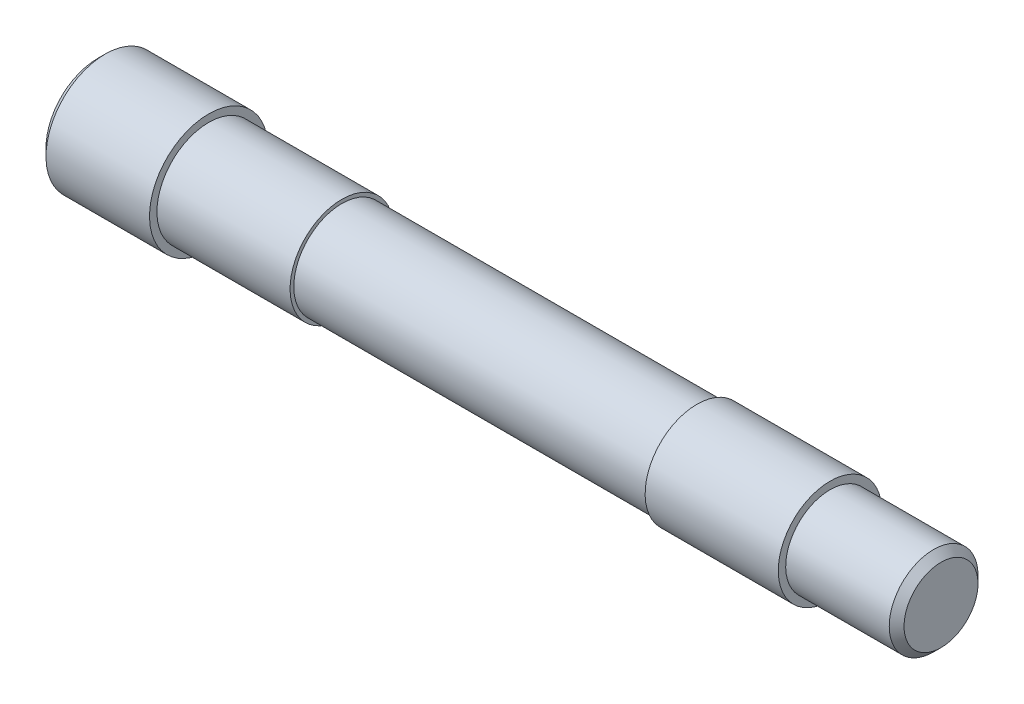
ISO-10303-21;
HEADER;
FILE_DESCRIPTION(('STEP AP214'),'2;1');
FILE_NAME('part.step','',(''),(''),'','','');
FILE_SCHEMA(('AUTOMOTIVE_DESIGN { 1 0 10303 214 1 1 1 1 }'));
ENDSEC;
DATA;
#1=APPLICATION_CONTEXT('core data for automotive mechanical design processes');
#2=APPLICATION_PROTOCOL_DEFINITION('international standard','automotive_design',2000,#1);
#3=PRODUCT_CONTEXT('',#1,'mechanical');
#4=PRODUCT('Part','Part','',(#3));
#5=PRODUCT_RELATED_PRODUCT_CATEGORY('part','',(#4));
#6=PRODUCT_DEFINITION_FORMATION('','',#4);
#7=PRODUCT_DEFINITION_CONTEXT('part definition',#1,'design');
#8=PRODUCT_DEFINITION('design','',#6,#7);
#9=PRODUCT_DEFINITION_SHAPE('','',#8);
#10=(LENGTH_UNIT() NAMED_UNIT(*) SI_UNIT(.MILLI.,.METRE.));
#11=(NAMED_UNIT(*) PLANE_ANGLE_UNIT() SI_UNIT($,.RADIAN.));
#12=(NAMED_UNIT(*) SI_UNIT($,.STERADIAN.) SOLID_ANGLE_UNIT());
#13=UNCERTAINTY_MEASURE_WITH_UNIT(LENGTH_MEASURE(1.E-05),#10,'distance_accuracy_value','');
#14=(GEOMETRIC_REPRESENTATION_CONTEXT(3) GLOBAL_UNCERTAINTY_ASSIGNED_CONTEXT((#13)) GLOBAL_UNIT_ASSIGNED_CONTEXT((#10,
#11,#12)) REPRESENTATION_CONTEXT('',''));
#15=CARTESIAN_POINT('',(0.,0.,0.));
#16=DIRECTION('',(0.,0.,1.));
#17=DIRECTION('',(1.,0.,0.));
#18=AXIS2_PLACEMENT_3D('',#15,#16,#17);
#19=CARTESIAN_POINT('',(90.4875,0.,0.));
#20=DIRECTION('',(1.,0.,0.));
#21=DIRECTION('',(0.,1.,0.));
#22=AXIS2_PLACEMENT_3D('',#19,#20,#21);
#23=CYLINDRICAL_SURFACE('',#22,11.1125);
#24=CARTESIAN_POINT('',(-66.675,0.,0.));
#25=DIRECTION('',(1.,0.,0.));
#26=DIRECTION('',(0.,1.,0.));
#27=AXIS2_PLACEMENT_3D('',#24,#25,#26);
#28=CIRCLE('',#27,11.1125);
#29=CARTESIAN_POINT('',(-66.675,11.1125,0.));
#30=VERTEX_POINT('',#29);
#31=EDGE_CURVE('E99',#30,#30,#28,.T.);
#32=ORIENTED_EDGE('',*,*,#31,.T.);
#33=EDGE_LOOP('',(#32));
#34=FACE_BOUND('',#33,.T.);
#35=CARTESIAN_POINT('',(-38.1,0.,0.));
#36=DIRECTION('',(1.,0.,0.));
#37=DIRECTION('',(0.,1.,0.));
#38=AXIS2_PLACEMENT_3D('',#35,#36,#37);
#39=CIRCLE('',#38,11.1125);
#40=CARTESIAN_POINT('',(-38.1,11.1125,0.));
#41=VERTEX_POINT('',#40);
#42=EDGE_CURVE('E95',#41,#41,#39,.T.);
#43=ORIENTED_EDGE('',*,*,#42,.F.);
#44=EDGE_LOOP('',(#43));
#45=FACE_BOUND('',#44,.T.);
#46=CARTESIAN_POINT('',(-52.3875,-10.0402315710346,-4.76250000000007));
#47=CARTESIAN_POINT('',(-52.5141828804468,-10.0402325969404,-4.76249904362129));
#48=CARTESIAN_POINT('',(-52.6409064333006,-10.0426375136056,-4.75743803928859));
#49=CARTESIAN_POINT('',(-52.8934250466017,-10.052177346996,-4.73724682752057));
#50=CARTESIAN_POINT('',(-53.0192194731577,-10.0593152367777,-4.72211029103261));
#51=CARTESIAN_POINT('',(-53.2691379894666,-10.0780939995445,-4.68189812277268));
#52=CARTESIAN_POINT('',(-53.3932580929368,-10.0897441420218,-4.65680202851194));
#53=CARTESIAN_POINT('',(-53.6387244643791,-10.1171598826129,-4.59693531067393));
#54=CARTESIAN_POINT('',(-53.7600695374984,-10.1329272184985,-4.56216060156893));
#55=CARTESIAN_POINT('',(-53.9985897140359,-10.1679895638285,-4.48346833541121));
#56=CARTESIAN_POINT('',(-54.1157817240076,-10.1872676592125,-4.43959448106279));
#57=CARTESIAN_POINT('',(-54.3459229544943,-10.2288238220674,-4.342992474337));
#58=CARTESIAN_POINT('',(-54.4588705552433,-10.2511030202539,-4.29026098283804));
#59=CARTESIAN_POINT('',(-54.7902658898937,-10.3214847106019,-4.11943845683515));
#60=CARTESIAN_POINT('',(-55.0015564491775,-10.3731764446023,-3.98862276285137));
#61=CARTESIAN_POINT('',(-55.4124344926916,-10.4840302210821,-3.68781125380695));
#62=CARTESIAN_POINT('',(-55.6105664688738,-10.5434541391098,-3.51594021831403));
#63=CARTESIAN_POINT('',(-55.9763771864909,-10.6609693699898,-3.14161553012609));
#64=CARTESIAN_POINT('',(-56.1440437828889,-10.7190601433559,-2.9391497394736));
#65=CARTESIAN_POINT('',(-56.3728288056631,-10.8020251157082,-2.61103699792038));
#66=CARTESIAN_POINT('',(-56.44666382215,-10.829543805133,-2.49472243464819));
#67=CARTESIAN_POINT('',(-56.5841992555438,-10.8818420364386,-2.25568279699365));
#68=CARTESIAN_POINT('',(-56.6479039018757,-10.9066227201098,-2.13296042644513));
#69=CARTESIAN_POINT('',(-56.7646056405788,-10.9527361704598,-1.88189373147878));
#70=CARTESIAN_POINT('',(-56.817601862065,-10.9740686566785,-1.75354895083864));
#71=CARTESIAN_POINT('',(-56.9123154621578,-11.0126442464736,-1.49222995833974));
#72=CARTESIAN_POINT('',(-56.9540385586117,-11.0298894226294,-1.35925813214682));
#73=CARTESIAN_POINT('',(-57.0238127155756,-11.0589645161395,-1.0970013136905));
#74=CARTESIAN_POINT('',(-57.0524828153416,-11.0710375060906,-0.967907801908478));
#75=CARTESIAN_POINT('',(-57.0990098975254,-11.090722703686,-0.707505404253108));
#76=CARTESIAN_POINT('',(-57.1168717558027,-11.0983369227396,-0.576197544846698));
#77=CARTESIAN_POINT('',(-57.1415901213372,-11.1088927374394,-0.312383248294223));
#78=CARTESIAN_POINT('',(-57.1484483538287,-11.1118350655803,-0.179877002317412));
#79=CARTESIAN_POINT('',(-57.1510817258316,-11.1129635440452,0.0852632517530881));
#80=CARTESIAN_POINT('',(-57.1468573249695,-11.1111498916125,0.21789725432032));
#81=CARTESIAN_POINT('',(-57.1280084792185,-11.1030899023065,0.473657223833151));
#82=CARTESIAN_POINT('',(-57.1140733986282,-11.0971374396123,0.59684398197315));
#83=CARTESIAN_POINT('',(-57.0766930569777,-11.081267776878,0.841546457427787));
#84=CARTESIAN_POINT('',(-57.0532446608771,-11.0713492698738,0.963061610216201));
#85=CARTESIAN_POINT('',(-56.9970743252758,-11.0477949789557,1.20352157803154));
#86=CARTESIAN_POINT('',(-56.9643554674778,-11.034160430392,1.32246723309756));
#87=CARTESIAN_POINT('',(-56.8899500838508,-11.0035070800928,1.55708754561782));
#88=CARTESIAN_POINT('',(-56.8482601327208,-10.9864869858923,1.6727609345299));
#89=CARTESIAN_POINT('',(-56.708864376875,-10.9303729511956,2.01718924225048));
#90=CARTESIAN_POINT('',(-56.5976471367884,-10.8865804410412,2.23988472610391));
#91=CARTESIAN_POINT('',(-56.3430327301366,-10.7906732532717,2.66391965478252));
#92=CARTESIAN_POINT('',(-56.1996240028009,-10.7385555878285,2.86525138899991));
#93=CARTESIAN_POINT('',(-55.8723786172363,-10.6266292662245,3.25681591132487));
#94=CARTESIAN_POINT('',(-55.6863363743275,-10.5665368722659,3.44512653663495));
#95=CARTESIAN_POINT('',(-55.2851179068657,-10.4482447303289,3.788792131285));
#96=CARTESIAN_POINT('',(-55.0699291715533,-10.3900458084769,3.94413287481824));
#97=CARTESIAN_POINT('',(-54.7249107118727,-10.3080841218763,4.15173198935317));
#98=CARTESIAN_POINT('',(-54.6038273524768,-10.2812256744591,4.21762641966527));
#99=CARTESIAN_POINT('',(-54.3558886588281,-10.2306452318648,4.33887852843755));
#100=CARTESIAN_POINT('',(-54.2290358830957,-10.2069218642793,4.39424082212879));
#101=CARTESIAN_POINT('',(-53.9704172334104,-10.1634458090569,4.49388304354103));
#102=CARTESIAN_POINT('',(-53.8386521833319,-10.1436924590987,4.53816482013626));
#103=CARTESIAN_POINT('',(-53.5712351125706,-10.1089032030434,4.61514026331628));
#104=CARTESIAN_POINT('',(-53.4355852272073,-10.0938647576959,4.64784016864714));
#105=CARTESIAN_POINT('',(-53.1706676785995,-10.0699246654428,4.6994709480566));
#106=CARTESIAN_POINT('',(-53.0415820875754,-10.0606790992216,4.7191781527134));
#107=CARTESIAN_POINT('',(-52.7820245533617,-10.0471446489349,4.74792537046591));
#108=CARTESIAN_POINT('',(-52.6515532761868,-10.0428534835363,4.75697029321997));
#109=CARTESIAN_POINT('',(-52.39025687247,-10.0393821403968,4.76429208866958));
#110=CARTESIAN_POINT('',(-52.2594317910758,-10.0402013386981,4.76257027594611));
#111=CARTESIAN_POINT('',(-51.9985019415111,-10.0469178556913,4.74838485353756));
#112=CARTESIAN_POINT('',(-51.8683971492327,-10.0528150033793,4.7359216055785));
#113=CARTESIAN_POINT('',(-51.6189778931113,-10.0688871369255,4.70164853407326));
#114=CARTESIAN_POINT('',(-51.4995438703449,-10.0787349853001,4.68055141704967));
#115=CARTESIAN_POINT('',(-51.2629836856427,-10.1023216104455,4.62942063850169));
#116=CARTESIAN_POINT('',(-51.1458582893341,-10.116061655543,4.59938406376827));
#117=CARTESIAN_POINT('',(-50.799104903184,-10.1625277917537,4.49627077497956));
#118=CARTESIAN_POINT('',(-50.5739130081174,-10.2005128967651,4.41016440741411));
#119=CARTESIAN_POINT('',(-50.1312909278324,-10.2882190863004,4.20160087962271));
#120=CARTESIAN_POINT('',(-49.9146239159515,-10.3383786296689,4.07772600719838));
#121=CARTESIAN_POINT('',(-49.5040589727371,-10.4441893772466,3.79853529193968));
#122=CARTESIAN_POINT('',(-49.3101713466989,-10.4998430461826,3.64320530483348));
#123=CARTESIAN_POINT('',(-48.9330274699148,-10.6162454816267,3.28944536408149));
#124=CARTESIAN_POINT('',(-48.7521670578266,-10.6770159298943,3.08844018522492));
#125=CARTESIAN_POINT('',(-48.5078791350755,-10.7634529566788,2.76554570064577));
#126=CARTESIAN_POINT('',(-48.4309113691931,-10.7914946070146,2.65427492872815));
#127=CARTESIAN_POINT('',(-48.286511150603,-10.8452693574178,2.42520045501389));
#128=CARTESIAN_POINT('',(-48.219074584064,-10.8710034517024,2.30739960246779));
#129=CARTESIAN_POINT('',(-48.0939552363026,-10.9195894546556,2.06532109479202));
#130=CARTESIAN_POINT('',(-48.0363275098994,-10.9424249231112,1.94101169273263));
#131=CARTESIAN_POINT('',(-47.9318414078685,-10.984391391894,1.68739722807899));
#132=CARTESIAN_POINT('',(-47.8849783637866,-11.003523997519,1.55809435959187));
#133=CARTESIAN_POINT('',(-47.8025047237625,-11.037527784676,1.29544053122679));
#134=CARTESIAN_POINT('',(-47.7668907909068,-11.0524002298111,1.16209078469593));
#135=CARTESIAN_POINT('',(-47.7073152501637,-11.0774386369058,0.892381588995459));
#136=CARTESIAN_POINT('',(-47.6833527044129,-11.0876049776739,0.756022382992358));
#137=CARTESIAN_POINT('',(-47.6486977301429,-11.1023543434429,0.491547806904289));
#138=CARTESIAN_POINT('',(-47.6371600740086,-11.1072925381709,0.363562345802508));
#139=CARTESIAN_POINT('',(-47.6244674518875,-11.11272671993,0.106936506074879));
#140=CARTESIAN_POINT('',(-47.6233159689649,-11.1132212167406,-0.0217040777806228));
#141=CARTESIAN_POINT('',(-47.6314167925992,-11.1097508682729,-0.278523691638308));
#142=CARTESIAN_POINT('',(-47.6406633080294,-11.1057885052258,-0.406702938710522));
#143=CARTESIAN_POINT('',(-47.669450810522,-11.0935147439634,-0.661735292913394));
#144=CARTESIAN_POINT('',(-47.6889956264338,-11.0852017282081,-0.788587888901124));
#145=CARTESIAN_POINT('',(-47.7371981139599,-11.0648587180221,-1.034999941996));
#146=CARTESIAN_POINT('',(-47.7654643255638,-11.0529889280872,-1.15464929733552));
#147=CARTESIAN_POINT('',(-47.8310266663939,-11.0257344865117,-1.3910524534564));
#148=CARTESIAN_POINT('',(-47.868325937382,-11.0103486120573,-1.50780523117774));
#149=CARTESIAN_POINT('',(-47.9932915093685,-10.9594457022784,-1.85255955191124));
#150=CARTESIAN_POINT('',(-48.0940656531542,-10.9191657761472,-2.0752595161414));
#151=CARTESIAN_POINT('',(-48.3327043814986,-10.8275103738181,-2.51089487302772));
#152=CARTESIAN_POINT('',(-48.472051446527,-10.7757125102392,-2.72292117078593));
#153=CARTESIAN_POINT('',(-48.7817666684953,-10.6670759497092,-3.12151619293264));
#154=CARTESIAN_POINT('',(-48.9521470991217,-10.6102352629014,-3.30807479359973));
#155=CARTESIAN_POINT('',(-49.3338122365583,-10.4926674661582,-3.66460736004524));
#156=CARTESIAN_POINT('',(-49.5471690562769,-10.4319579298297,-3.83239263286584));
#157=CARTESIAN_POINT('',(-49.8870772463632,-10.3463176018151,-4.05558333553942));
#158=CARTESIAN_POINT('',(-50.003802308297,-10.3186531320894,-4.12528054643868));
#159=CARTESIAN_POINT('',(-50.2432358619106,-10.2659877031333,-4.25464706024784));
#160=CARTESIAN_POINT('',(-50.3659415994361,-10.2409855344711,-4.3143209237458));
#161=CARTESIAN_POINT('',(-50.6164271703495,-10.1944995742002,-4.42304557669483));
#162=CARTESIAN_POINT('',(-50.7442005578324,-10.1730114805166,-4.47210937951339));
#163=CARTESIAN_POINT('',(-51.0040276128428,-10.1342864121107,-4.55918495211931));
#164=CARTESIAN_POINT('',(-51.1360791258852,-10.1170473340895,-4.5972021917239));
#165=CARTESIAN_POINT('',(-51.4031380080867,-10.0874998003113,-4.66168003506874));
#166=CARTESIAN_POINT('',(-51.5381365916114,-10.0751783660065,-4.68817107543133));
#167=CARTESIAN_POINT('',(-51.8102264959936,-10.0558994206209,-4.72938339219646));
#168=CARTESIAN_POINT('',(-51.9473161308035,-10.0489377991736,-4.74411368807321));
#169=CARTESIAN_POINT('',(-52.1351848860094,-10.0432747601674,-4.75607982283743));
#170=CARTESIAN_POINT('',(-52.1856083885563,-10.0421344611403,-4.75848658750002));
#171=CARTESIAN_POINT('',(-52.2865191062077,-10.0406126560461,-4.76169687951195));
#172=CARTESIAN_POINT('',(-52.337006322319,-10.0402311621257,-4.76250038119665));
#173=CARTESIAN_POINT('',(-52.3875,-10.0402315710346,-4.76250000000007));
#174=B_SPLINE_CURVE_WITH_KNOTS('',3,(#46,#47,#48,#49,#50,#51,#52,#53,#54,#55,#56,#57,#58,#59,
#60,#61,#62,#63,#64,#65,#66,#67,#68,#69,#70,#71,#72,#73,#74,#75,#76,#77,#78,#79,#80,#81,#82,#83,
#84,#85,#86,#87,#88,#89,#90,#91,#92,#93,#94,#95,#96,#97,#98,#99,#100,#101,#102,#103,#104,#105,
#106,#107,#108,#109,#110,#111,#112,#113,#114,#115,#116,#117,#118,#119,#120,#121,#122,#123,#124,
#125,#126,#127,#128,#129,#130,#131,#132,#133,#134,#135,#136,#137,#138,#139,#140,#141,#142,#143,
#144,#145,#146,#147,#148,#149,#150,#151,#152,#153,#154,#155,#156,#157,#158,#159,#160,#161,#162,
#163,#164,#165,#166,#167,#168,#169,#170,#171,#172,#173),.UNSPECIFIED.,.T.,.F.,(4,2,2,2,2,2,2,2,
2,2,2,2,2,2,2,2,2,2,2,2,2,2,2,2,2,2,2,2,2,2,2,2,2,2,2,2,2,2,2,2,2,2,2,2,2,2,2,2,2,2,2,2,2,2,2,2,
2,2,2,2,2,2,2,4),(0.,0.379996147434221,0.760231219030245,1.14125158394575,1.52243302938757,
1.90182440554227,2.28135912565194,3.03951136369131,3.84300275967306,4.64681376843505,
5.06784254342275,5.48869507495362,5.90958181943651,6.33025468327852,6.72810029452665,
7.12576629391629,7.52336993802691,7.92095709270501,8.29286402725808,8.66489362057627,
9.03679968799005,9.40884800760239,10.1635571437603,10.9185377497519,11.7293564208537,
12.5405242350145,12.9614018841597,13.38209467579,13.8027172245336,14.2231128529018,
14.6153153058755,15.0073370908478,15.3993110122574,15.791271734162,16.1558879487009,
16.5206231154772,17.2495332786103,18.0101355645943,18.7710806294894,19.5982857552812,
20.0123966307316,20.4263282192946,20.8425115379312,21.2585140229403,21.6743929896757,
22.0902384752313,22.4755480808174,22.8609868974454,23.2462111516255,23.6315787311553,
24.0016878682789,24.3719259173181,25.111788000185,25.8854064142085,26.659331461077,
27.4894672598562,27.9052589143612,28.3208608696204,28.735950156034,29.1508335551688,
29.5646146445831,29.9780780940374,30.1295357794089,30.2809958892585),.UNSPECIFIED.);
#175=CARTESIAN_POINT('',(-52.3875,-10.0402315710346,-4.76250000000007));
#176=VERTEX_POINT('',#175);
#177=EDGE_CURVE('E10',#176,#176,#174,.T.);
#178=ORIENTED_EDGE('',*,*,#177,.T.);
#179=EDGE_LOOP('',(#178));
#180=FACE_BOUND('',#179,.T.);
#181=ADVANCED_FACE('F41',(#34,#45,#180),#23,.T.);
#182=CARTESIAN_POINT('',(-90.4875,0.,0.));
#183=DIRECTION('',(1.,0.,0.));
#184=DIRECTION('',(0.,1.,0.));
#185=AXIS2_PLACEMENT_3D('',#182,#183,#184);
#186=PLANE('',#185);
#187=CARTESIAN_POINT('',(-90.4875,0.,0.));
#188=DIRECTION('',(1.,0.,0.));
#189=DIRECTION('',(0.,1.,0.));
#190=AXIS2_PLACEMENT_3D('',#187,#188,#189);
#191=CIRCLE('',#190,11.1125);
#192=CARTESIAN_POINT('',(-90.4875,11.1124999999999,0.));
#193=VERTEX_POINT('',#192);
#194=EDGE_CURVE('E55',#193,#193,#191,.F.);
#195=ORIENTED_EDGE('',*,*,#194,.T.);
#196=EDGE_LOOP('',(#195));
#197=FACE_BOUND('',#196,.T.);
#198=ADVANCED_FACE('F123',(#197),#186,.F.);
#199=CARTESIAN_POINT('',(90.4875,0.,0.));
#200=DIRECTION('',(-1.,0.,0.));
#201=DIRECTION('',(0.,-1.,0.));
#202=AXIS2_PLACEMENT_3D('',#199,#200,#201);
#203=PLANE('',#202);
#204=CARTESIAN_POINT('',(90.4875,0.,0.));
#205=DIRECTION('',(-1.,0.,0.));
#206=DIRECTION('',(0.,-1.,0.));
#207=AXIS2_PLACEMENT_3D('',#204,#205,#206);
#208=CIRCLE('',#207,7.93749999999999);
#209=CARTESIAN_POINT('',(90.4875,-7.9375,0.));
#210=VERTEX_POINT('',#209);
#211=EDGE_CURVE('E71',#210,#210,#208,.F.);
#212=ORIENTED_EDGE('',*,*,#211,.T.);
#213=EDGE_LOOP('',(#212));
#214=FACE_BOUND('',#213,.T.);
#215=ADVANCED_FACE('F128',(#214),#203,.F.);
#216=CARTESIAN_POINT('',(90.4875,0.,0.));
#217=DIRECTION('',(1.,0.,0.));
#218=DIRECTION('',(0.,1.,0.));
#219=AXIS2_PLACEMENT_3D('',#216,#217,#218);
#220=CYLINDRICAL_SURFACE('',#219,9.525);
#221=CARTESIAN_POINT('',(88.9,0.,0.));
#222=DIRECTION('',(-1.,0.,0.));
#223=DIRECTION('',(0.,-1.,0.));
#224=AXIS2_PLACEMENT_3D('',#221,#222,#223);
#225=CIRCLE('',#224,9.525);
#226=CARTESIAN_POINT('',(88.9,-9.52500000000001,0.));
#227=VERTEX_POINT('',#226);
#228=EDGE_CURVE('E65',#227,#227,#225,.T.);
#229=ORIENTED_EDGE('',*,*,#228,.T.);
#230=EDGE_LOOP('',(#229));
#231=FACE_BOUND('',#230,.T.);
#232=CARTESIAN_POINT('',(66.675,0.,0.));
#233=DIRECTION('',(1.,0.,0.));
#234=DIRECTION('',(0.,1.,0.));
#235=AXIS2_PLACEMENT_3D('',#232,#233,#234);
#236=CIRCLE('',#235,9.525);
#237=CARTESIAN_POINT('',(66.675,9.52499999999998,0.));
#238=VERTEX_POINT('',#237);
#239=EDGE_CURVE('E75',#238,#238,#236,.T.);
#240=ORIENTED_EDGE('',*,*,#239,.T.);
#241=EDGE_LOOP('',(#240));
#242=FACE_BOUND('',#241,.T.);
#243=ADVANCED_FACE('F155',(#231,#242),#220,.T.);
#244=CARTESIAN_POINT('',(66.675,0.,0.));
#245=DIRECTION('',(-1.,0.,0.));
#246=DIRECTION('',(0.,-1.,0.));
#247=AXIS2_PLACEMENT_3D('',#244,#245,#246);
#248=PLANE('',#247);
#249=ORIENTED_EDGE('',*,*,#239,.F.);
#250=EDGE_LOOP('',(#249));
#251=FACE_BOUND('',#250,.T.);
#252=CARTESIAN_POINT('',(66.675,0.,0.));
#253=DIRECTION('',(1.,0.,0.));
#254=DIRECTION('',(0.,1.,0.));
#255=AXIS2_PLACEMENT_3D('',#252,#253,#254);
#256=CIRCLE('',#255,11.1125);
#257=CARTESIAN_POINT('',(66.675,11.1125,0.));
#258=VERTEX_POINT('',#257);
#259=EDGE_CURVE('E79',#258,#258,#256,.T.);
#260=ORIENTED_EDGE('',*,*,#259,.T.);
#261=EDGE_LOOP('',(#260));
#262=FACE_BOUND('',#261,.T.);
#263=ADVANCED_FACE('F151',(#251,#262),#248,.F.);
#264=CARTESIAN_POINT('',(90.4875,0.,0.));
#265=DIRECTION('',(1.,0.,0.));
#266=DIRECTION('',(0.,1.,0.));
#267=AXIS2_PLACEMENT_3D('',#264,#265,#266);
#268=CYLINDRICAL_SURFACE('',#267,11.1125);
#269=ORIENTED_EDGE('',*,*,#259,.F.);
#270=EDGE_LOOP('',(#269));
#271=FACE_BOUND('',#270,.T.);
#272=CARTESIAN_POINT('',(38.1,0.,0.));
#273=DIRECTION('',(1.,0.,0.));
#274=DIRECTION('',(0.,1.,0.));
#275=AXIS2_PLACEMENT_3D('',#272,#273,#274);
#276=CIRCLE('',#275,11.1125);
#277=CARTESIAN_POINT('',(38.1,11.1125,0.));
#278=VERTEX_POINT('',#277);
#279=EDGE_CURVE('E83',#278,#278,#276,.T.);
#280=ORIENTED_EDGE('',*,*,#279,.T.);
#281=EDGE_LOOP('',(#280));
#282=FACE_BOUND('',#281,.T.);
#283=ADVANCED_FACE('F147',(#271,#282),#268,.T.);
#284=CARTESIAN_POINT('',(38.1,0.,0.));
#285=DIRECTION('',(1.,0.,0.));
#286=DIRECTION('',(0.,1.,0.));
#287=AXIS2_PLACEMENT_3D('',#284,#285,#286);
#288=PLANE('',#287);
#289=ORIENTED_EDGE('',*,*,#279,.F.);
#290=EDGE_LOOP('',(#289));
#291=FACE_BOUND('',#290,.T.);
#292=CARTESIAN_POINT('',(38.1,0.,0.));
#293=DIRECTION('',(1.,0.,0.));
#294=DIRECTION('',(0.,1.,0.));
#295=AXIS2_PLACEMENT_3D('',#292,#293,#294);
#296=CIRCLE('',#295,10.31875);
#297=CARTESIAN_POINT('',(38.1,10.31875,0.));
#298=VERTEX_POINT('',#297);
#299=EDGE_CURVE('E87',#298,#298,#296,.T.);
#300=ORIENTED_EDGE('',*,*,#299,.T.);
#301=EDGE_LOOP('',(#300));
#302=FACE_BOUND('',#301,.T.);
#303=ADVANCED_FACE('F143',(#291,#302),#288,.F.);
#304=CARTESIAN_POINT('',(90.4875,0.,0.));
#305=DIRECTION('',(1.,0.,0.));
#306=DIRECTION('',(0.,1.,0.));
#307=AXIS2_PLACEMENT_3D('',#304,#305,#306);
#308=CYLINDRICAL_SURFACE('',#307,10.31875);
#309=ORIENTED_EDGE('',*,*,#299,.F.);
#310=EDGE_LOOP('',(#309));
#311=FACE_BOUND('',#310,.T.);
#312=CARTESIAN_POINT('',(-38.1,0.,0.));
#313=DIRECTION('',(1.,0.,0.));
#314=DIRECTION('',(0.,1.,0.));
#315=AXIS2_PLACEMENT_3D('',#312,#313,#314);
#316=CIRCLE('',#315,10.31875);
#317=CARTESIAN_POINT('',(-38.1,10.31875,0.));
#318=VERTEX_POINT('',#317);
#319=EDGE_CURVE('E91',#318,#318,#316,.T.);
#320=ORIENTED_EDGE('',*,*,#319,.T.);
#321=EDGE_LOOP('',(#320));
#322=FACE_BOUND('',#321,.T.);
#323=ADVANCED_FACE('F139',(#311,#322),#308,.T.);
#324=CARTESIAN_POINT('',(-38.1,0.,0.));
#325=DIRECTION('',(1.,0.,0.));
#326=DIRECTION('',(0.,1.,0.));
#327=AXIS2_PLACEMENT_3D('',#324,#325,#326);
#328=PLANE('',#327);
#329=ORIENTED_EDGE('',*,*,#42,.T.);
#330=EDGE_LOOP('',(#329));
#331=FACE_BOUND('',#330,.T.);
#332=ORIENTED_EDGE('',*,*,#319,.F.);
#333=EDGE_LOOP('',(#332));
#334=FACE_BOUND('',#333,.T.);
#335=ADVANCED_FACE('F136',(#331,#334),#328,.T.);
#336=CARTESIAN_POINT('',(-66.675,0.,0.));
#337=DIRECTION('',(1.,0.,0.));
#338=DIRECTION('',(0.,1.,0.));
#339=AXIS2_PLACEMENT_3D('',#336,#337,#338);
#340=PLANE('',#339);
#341=CARTESIAN_POINT('',(-66.675,0.,0.));
#342=DIRECTION('',(1.,0.,0.));
#343=DIRECTION('',(0.,1.,0.));
#344=AXIS2_PLACEMENT_3D('',#341,#342,#343);
#345=CIRCLE('',#344,12.7);
#346=CARTESIAN_POINT('',(-66.675,12.7,0.));
#347=VERTEX_POINT('',#346);
#348=EDGE_CURVE('E103',#347,#347,#345,.T.);
#349=ORIENTED_EDGE('',*,*,#348,.T.);
#350=EDGE_LOOP('',(#349));
#351=FACE_BOUND('',#350,.T.);
#352=ORIENTED_EDGE('',*,*,#31,.F.);
#353=EDGE_LOOP('',(#352));
#354=FACE_BOUND('',#353,.T.);
#355=ADVANCED_FACE('F134',(#351,#354),#340,.T.);
#356=CARTESIAN_POINT('',(90.4875,0.,0.));
#357=DIRECTION('',(1.,0.,0.));
#358=DIRECTION('',(0.,1.,0.));
#359=AXIS2_PLACEMENT_3D('',#356,#357,#358);
#360=CYLINDRICAL_SURFACE('',#359,12.7);
#361=CARTESIAN_POINT('',(-88.8999999999999,0.,0.));
#362=DIRECTION('',(1.,0.,0.));
#363=DIRECTION('',(0.,1.,0.));
#364=AXIS2_PLACEMENT_3D('',#361,#362,#363);
#365=CIRCLE('',#364,12.7);
#366=CARTESIAN_POINT('',(-88.8999999999999,12.7,0.));
#367=VERTEX_POINT('',#366);
#368=EDGE_CURVE('E60',#367,#367,#365,.T.);
#369=ORIENTED_EDGE('',*,*,#368,.T.);
#370=EDGE_LOOP('',(#369));
#371=FACE_BOUND('',#370,.T.);
#372=ORIENTED_EDGE('',*,*,#348,.F.);
#373=EDGE_LOOP('',(#372));
#374=FACE_BOUND('',#373,.T.);
#375=ADVANCED_FACE('F167',(#371,#374),#360,.T.);
#376=CARTESIAN_POINT('',(90.4875,0.,0.));
#377=DIRECTION('',(-1.,0.,0.));
#378=DIRECTION('',(0.,-1.,0.));
#379=AXIS2_PLACEMENT_3D('',#376,#377,#378);
#380=CONICAL_SURFACE('',#379,7.93749999999999,0.785398163397449);
#381=CARTESIAN_POINT('',(88.9,-9.52500000000001,0.));
#382=CARTESIAN_POINT('',(88.9165364583333,-9.50846354166668,0.));
#383=CARTESIAN_POINT('',(88.9330729166667,-9.49192708333334,0.));
#384=CARTESIAN_POINT('',(88.9661458333333,-9.45885416666667,0.));
#385=CARTESIAN_POINT('',(88.9826822916667,-9.44231770833334,0.));
#386=CARTESIAN_POINT('',(89.0157552083333,-9.40924479166667,0.));
#387=CARTESIAN_POINT('',(89.0322916666667,-9.39270833333334,0.));
#388=CARTESIAN_POINT('',(89.0653645833333,-9.35963541666667,0.));
#389=CARTESIAN_POINT('',(89.0819010416667,-9.34309895833334,0.));
#390=CARTESIAN_POINT('',(89.1149739583333,-9.31002604166667,0.));
#391=CARTESIAN_POINT('',(89.1315104166667,-9.29348958333334,0.));
#392=CARTESIAN_POINT('',(89.1645833333333,-9.26041666666667,0.));
#393=CARTESIAN_POINT('',(89.1811197916667,-9.24388020833334,0.));
#394=CARTESIAN_POINT('',(89.2141927083333,-9.21080729166667,0.));
#395=CARTESIAN_POINT('',(89.2307291666667,-9.19427083333334,0.));
#396=CARTESIAN_POINT('',(89.2638020833333,-9.16119791666667,0.));
#397=CARTESIAN_POINT('',(89.2803385416667,-9.14466145833334,0.));
#398=CARTESIAN_POINT('',(89.3134114583333,-9.11158854166667,0.));
#399=CARTESIAN_POINT('',(89.3299479166667,-9.09505208333334,0.));
#400=CARTESIAN_POINT('',(89.3630208333333,-9.06197916666667,0.));
#401=CARTESIAN_POINT('',(89.3795572916667,-9.04544270833334,0.));
#402=CARTESIAN_POINT('',(89.4126302083333,-9.01236979166667,0.));
#403=CARTESIAN_POINT('',(89.4291666666667,-8.99583333333334,0.));
#404=CARTESIAN_POINT('',(89.4622395833333,-8.96276041666667,0.));
#405=CARTESIAN_POINT('',(89.4787760416667,-8.94622395833334,0.));
#406=CARTESIAN_POINT('',(89.5118489583333,-8.91315104166667,0.));
#407=CARTESIAN_POINT('',(89.5283854166667,-8.89661458333334,0.));
#408=CARTESIAN_POINT('',(89.5614583333333,-8.86354166666667,0.));
#409=CARTESIAN_POINT('',(89.5779947916667,-8.84700520833333,0.));
#410=CARTESIAN_POINT('',(89.6110677083333,-8.81393229166667,0.));
#411=CARTESIAN_POINT('',(89.6276041666667,-8.79739583333334,0.));
#412=CARTESIAN_POINT('',(89.6606770833333,-8.76432291666667,0.));
#413=CARTESIAN_POINT('',(89.6772135416667,-8.74778645833334,0.));
#414=CARTESIAN_POINT('',(89.7102864583333,-8.71471354166667,0.));
#415=CARTESIAN_POINT('',(89.7268229166667,-8.69817708333333,0.));
#416=CARTESIAN_POINT('',(89.7598958333333,-8.66510416666667,0.));
#417=CARTESIAN_POINT('',(89.7764322916667,-8.64856770833333,0.));
#418=CARTESIAN_POINT('',(89.8095052083333,-8.61549479166667,0.));
#419=CARTESIAN_POINT('',(89.8260416666667,-8.59895833333334,0.));
#420=CARTESIAN_POINT('',(89.8591145833333,-8.56588541666667,0.));
#421=CARTESIAN_POINT('',(89.8756510416667,-8.54934895833333,0.));
#422=CARTESIAN_POINT('',(89.9087239583333,-8.51627604166667,0.));
#423=CARTESIAN_POINT('',(89.9252604166667,-8.49973958333333,0.));
#424=CARTESIAN_POINT('',(89.9583333333333,-8.46666666666667,0.));
#425=CARTESIAN_POINT('',(89.9748697916667,-8.45013020833333,0.));
#426=CARTESIAN_POINT('',(90.0079427083333,-8.41705729166667,0.));
#427=CARTESIAN_POINT('',(90.0244791666667,-8.40052083333333,0.));
#428=CARTESIAN_POINT('',(90.0575520833333,-8.36744791666666,0.));
#429=CARTESIAN_POINT('',(90.0740885416667,-8.35091145833333,0.));
#430=CARTESIAN_POINT('',(90.1071614583333,-8.31783854166667,0.));
#431=CARTESIAN_POINT('',(90.1236979166667,-8.30130208333333,0.));
#432=CARTESIAN_POINT('',(90.1567708333333,-8.26822916666666,0.));
#433=CARTESIAN_POINT('',(90.1733072916667,-8.25169270833333,0.));
#434=CARTESIAN_POINT('',(90.2063802083333,-8.21861979166667,0.));
#435=CARTESIAN_POINT('',(90.2229166666667,-8.20208333333333,0.));
#436=CARTESIAN_POINT('',(90.2559895833333,-8.16901041666667,0.));
#437=CARTESIAN_POINT('',(90.2725260416667,-8.15247395833333,0.));
#438=CARTESIAN_POINT('',(90.3055989583333,-8.11940104166666,0.));
#439=CARTESIAN_POINT('',(90.3221354166667,-8.10286458333333,0.));
#440=CARTESIAN_POINT('',(90.3552083333333,-8.06979166666666,0.));
#441=CARTESIAN_POINT('',(90.3717447916667,-8.05325520833333,0.));
#442=CARTESIAN_POINT('',(90.4048177083333,-8.02018229166667,0.));
#443=CARTESIAN_POINT('',(90.4213541666667,-8.00364583333333,0.));
#444=CARTESIAN_POINT('',(90.4544270833333,-7.97057291666666,0.));
#445=CARTESIAN_POINT('',(90.4709635416667,-7.95403645833333,0.));
#446=CARTESIAN_POINT('',(90.4875,-7.9375,0.));
#447=B_SPLINE_CURVE_WITH_KNOTS('',3,(#381,#382,#383,#384,#385,#386,#387,#388,#389,#390,#391,
#392,#393,#394,#395,#396,#397,#398,#399,#400,#401,#402,#403,#404,#405,#406,#407,#408,#409,#410,
#411,#412,#413,#414,#415,#416,#417,#418,#419,#420,#421,#422,#423,#424,#425,#426,#427,#428,#429,
#430,#431,#432,#433,#434,#435,#436,#437,#438,#439,#440,#441,#442,#443,#444,#445,#446),
.UNSPECIFIED.,.F.,.F.,(4,2,2,2,2,2,2,2,2,2,2,2,2,2,2,2,2,2,2,2,2,2,2,2,2,2,2,2,2,2,2,2,4),(0.,
0.0701582509458585,0.140316501891708,0.210474752837568,0.280633003783418,0.350791254729268,
0.420949505675128,0.491107756620977,0.561266007566827,0.631424258512686,0.701582509458536,
0.771740760404386,0.841899011350246,0.912057262296095,0.982215513241945,1.0523737641878,
1.12253201513365,1.1926902660795,1.26284851702536,1.33300676797121,1.40316501891706,
1.47332326986292,1.54348152080877,1.61363977175462,1.68379802270048,1.75395627364633,
1.82411452459218,1.89427277553804,1.96443102648389,2.03458927742974,2.1047475283756,
2.17490577932145,2.2450640302673),.UNSPECIFIED.);
#448=EDGE_CURVE('BSEAM163',#227,#210,#447,.T.);
#449=ORIENTED_EDGE('',*,*,#228,.F.);
#450=ORIENTED_EDGE('',*,*,#211,.F.);
#451=ORIENTED_EDGE('',*,*,#448,.T.);
#452=ORIENTED_EDGE('',*,*,#448,.F.);
#453=EDGE_LOOP('',(#449,#451,#450,#452));
#454=FACE_BOUND('',#453,.T.);
#455=ADVANCED_FACE('F163',(#454),#380,.T.);
#456=CARTESIAN_POINT('',(-88.8999999999999,0.,0.));
#457=DIRECTION('',(1.,0.,0.));
#458=DIRECTION('',(0.,1.,0.));
#459=AXIS2_PLACEMENT_3D('',#456,#457,#458);
#460=CONICAL_SURFACE('',#459,12.7,0.785398163397443);
#461=ORIENTED_EDGE('',*,*,#194,.F.);
#462=EDGE_LOOP('',(#461));
#463=FACE_BOUND('',#462,.T.);
#464=ORIENTED_EDGE('',*,*,#368,.F.);
#465=EDGE_LOOP('',(#464));
#466=FACE_BOUND('',#465,.T.);
#467=ADVANCED_FACE('F44',(#463,#466),#460,.T.);
#468=CARTESIAN_POINT('',(-52.3875,-6.35000000000003,0.));
#469=DIRECTION('',(0.,-1.,0.));
#470=DIRECTION('',(0.,0.,-1.));
#471=AXIS2_PLACEMENT_3D('',#468,#469,#470);
#472=PLANE('',#471);
#473=CARTESIAN_POINT('',(-52.3875,-6.35000000000008,0.));
#474=DIRECTION('',(0.,-1.,0.));
#475=DIRECTION('',(0.,0.,-1.));
#476=AXIS2_PLACEMENT_3D('',#473,#474,#475);
#477=CIRCLE('',#476,4.76250000000007);
#478=CARTESIAN_POINT('',(-52.3875,-6.35000000000008,-4.76250000000007));
#479=VERTEX_POINT('',#478);
#480=EDGE_CURVE('E107',#479,#479,#477,.T.);
#481=ORIENTED_EDGE('',*,*,#480,.T.);
#482=EDGE_LOOP('',(#481));
#483=FACE_BOUND('',#482,.T.);
#484=ADVANCED_FACE('F112',(#483),#472,.T.);
#485=CARTESIAN_POINT('',(-52.3875,-1001.13889949253,0.));
#486=DIRECTION('',(0.,-1.,0.));
#487=DIRECTION('',(0.,0.,-1.));
#488=AXIS2_PLACEMENT_3D('',#485,#486,#487);
#489=CYLINDRICAL_SURFACE('',#488,4.76250000000007);
#490=ORIENTED_EDGE('',*,*,#177,.F.);
#491=EDGE_LOOP('',(#490));
#492=FACE_BOUND('',#491,.T.);
#493=ORIENTED_EDGE('',*,*,#480,.F.);
#494=EDGE_LOOP('',(#493));
#495=FACE_BOUND('',#494,.T.);
#496=ADVANCED_FACE('F114',(#492,#495),#489,.F.);
#497=CLOSED_SHELL('',(#181,#198,#215,#243,#263,#283,#303,#323,#335,#355,#375,#455,#467,#484,#496));
#498=MANIFOLD_SOLID_BREP('B2',#497);
#499=ADVANCED_BREP_SHAPE_REPRESENTATION('',(#18,#498),#14);
#500=SHAPE_DEFINITION_REPRESENTATION(#9,#499);
ENDSEC;
END-ISO-10303-21;
